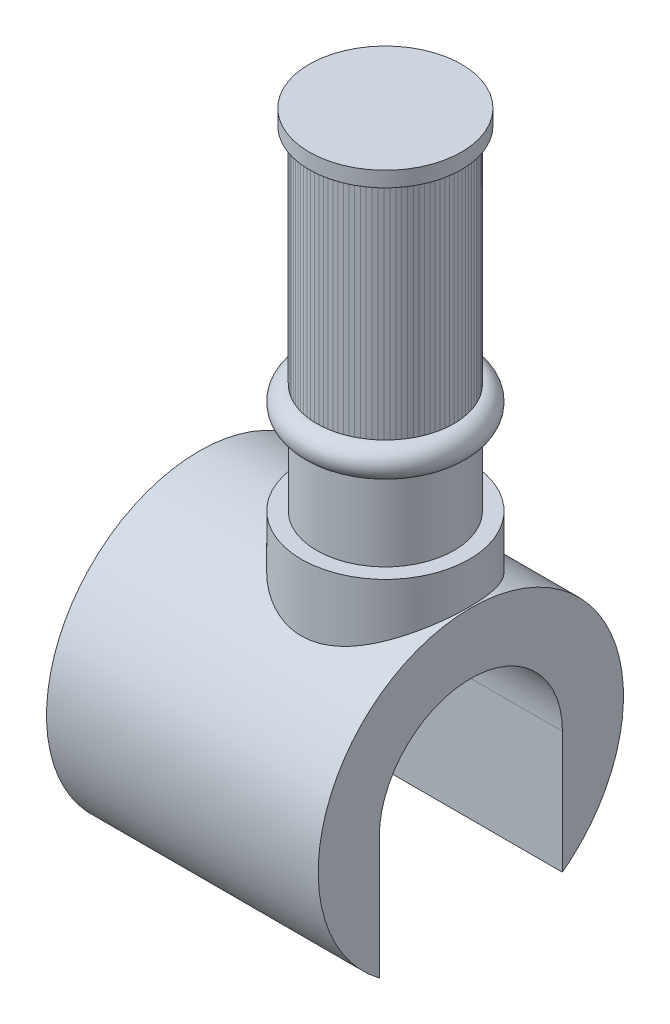
ISO-10303-21;
HEADER;
FILE_DESCRIPTION(('STEP AP214'),'2;1');
FILE_NAME('part.step','',(''),(''),'','','');
FILE_SCHEMA(('AUTOMOTIVE_DESIGN { 1 0 10303 214 1 1 1 1 }'));
ENDSEC;
DATA;
#1=APPLICATION_CONTEXT('core data for automotive mechanical design processes');
#2=APPLICATION_PROTOCOL_DEFINITION('international standard','automotive_design',2000,#1);
#3=PRODUCT_CONTEXT('',#1,'mechanical');
#4=PRODUCT('Part','Part','',(#3));
#5=PRODUCT_RELATED_PRODUCT_CATEGORY('part','',(#4));
#6=PRODUCT_DEFINITION_FORMATION('','',#4);
#7=PRODUCT_DEFINITION_CONTEXT('part definition',#1,'design');
#8=PRODUCT_DEFINITION('design','',#6,#7);
#9=PRODUCT_DEFINITION_SHAPE('','',#8);
#10=(LENGTH_UNIT() NAMED_UNIT(*) SI_UNIT(.MILLI.,.METRE.));
#11=(NAMED_UNIT(*) PLANE_ANGLE_UNIT() SI_UNIT($,.RADIAN.));
#12=(NAMED_UNIT(*) SI_UNIT($,.STERADIAN.) SOLID_ANGLE_UNIT());
#13=UNCERTAINTY_MEASURE_WITH_UNIT(LENGTH_MEASURE(1.E-05),#10,'distance_accuracy_value','');
#14=(GEOMETRIC_REPRESENTATION_CONTEXT(3) GLOBAL_UNCERTAINTY_ASSIGNED_CONTEXT((#13)) GLOBAL_UNIT_ASSIGNED_CONTEXT((#10,
#11,#12)) REPRESENTATION_CONTEXT('',''));
#15=CARTESIAN_POINT('',(0.,0.,0.));
#16=DIRECTION('',(0.,0.,1.));
#17=DIRECTION('',(1.,0.,0.));
#18=AXIS2_PLACEMENT_3D('',#15,#16,#17);
#19=CARTESIAN_POINT('',(0.,3.85,0.));
#20=DIRECTION('',(0.,-1.,0.));
#21=DIRECTION('',(0.,0.,-1.));
#22=AXIS2_PLACEMENT_3D('',#19,#20,#21);
#23=CYLINDRICAL_SURFACE('',#22,1.125);
#24=CARTESIAN_POINT('',(0.,3.85,0.));
#25=DIRECTION('',(0.,1.,0.));
#26=DIRECTION('',(0.,0.,1.));
#27=AXIS2_PLACEMENT_3D('',#24,#25,#26);
#28=CIRCLE('',#27,1.125);
#29=CARTESIAN_POINT('',(0.,3.85,-1.125));
#30=VERTEX_POINT('',#29);
#31=EDGE_CURVE('E11',#30,#30,#28,.T.);
#32=CARTESIAN_POINT('',(0.,0.,0.));
#33=DIRECTION('',(0.,1.,0.));
#34=DIRECTION('',(0.,0.,1.));
#35=AXIS2_PLACEMENT_3D('',#32,#33,#34);
#36=CIRCLE('',#35,1.125);
#37=CARTESIAN_POINT('',(0.,0.,-1.125));
#38=VERTEX_POINT('',#37);
#39=EDGE_CURVE('E50',#38,#38,#36,.T.);
#40=CARTESIAN_POINT('',(0.,3.85,-1.125));
#41=CARTESIAN_POINT('',(0.,3.80989583333333,-1.125));
#42=CARTESIAN_POINT('',(0.,3.76979166666667,-1.125));
#43=CARTESIAN_POINT('',(0.,3.68958333333333,-1.125));
#44=CARTESIAN_POINT('',(0.,3.64947916666667,-1.125));
#45=CARTESIAN_POINT('',(0.,3.56927083333333,-1.125));
#46=CARTESIAN_POINT('',(0.,3.52916666666667,-1.125));
#47=CARTESIAN_POINT('',(0.,3.44895833333333,-1.125));
#48=CARTESIAN_POINT('',(0.,3.40885416666667,-1.125));
#49=CARTESIAN_POINT('',(0.,3.32864583333333,-1.125));
#50=CARTESIAN_POINT('',(0.,3.28854166666667,-1.125));
#51=CARTESIAN_POINT('',(0.,3.20833333333333,-1.125));
#52=CARTESIAN_POINT('',(0.,3.16822916666667,-1.125));
#53=CARTESIAN_POINT('',(0.,3.08802083333333,-1.125));
#54=CARTESIAN_POINT('',(0.,3.04791666666667,-1.125));
#55=CARTESIAN_POINT('',(0.,2.96770833333333,-1.125));
#56=CARTESIAN_POINT('',(0.,2.92760416666667,-1.125));
#57=CARTESIAN_POINT('',(0.,2.84739583333333,-1.125));
#58=CARTESIAN_POINT('',(0.,2.80729166666667,-1.125));
#59=CARTESIAN_POINT('',(0.,2.72708333333333,-1.125));
#60=CARTESIAN_POINT('',(0.,2.68697916666667,-1.125));
#61=CARTESIAN_POINT('',(0.,2.60677083333333,-1.125));
#62=CARTESIAN_POINT('',(0.,2.56666666666667,-1.125));
#63=CARTESIAN_POINT('',(0.,2.48645833333333,-1.125));
#64=CARTESIAN_POINT('',(0.,2.44635416666667,-1.125));
#65=CARTESIAN_POINT('',(0.,2.36614583333333,-1.125));
#66=CARTESIAN_POINT('',(0.,2.32604166666667,-1.125));
#67=CARTESIAN_POINT('',(0.,2.24583333333333,-1.125));
#68=CARTESIAN_POINT('',(0.,2.20572916666667,-1.125));
#69=CARTESIAN_POINT('',(0.,2.12552083333333,-1.125));
#70=CARTESIAN_POINT('',(0.,2.08541666666667,-1.125));
#71=CARTESIAN_POINT('',(0.,2.00520833333333,-1.125));
#72=CARTESIAN_POINT('',(0.,1.96510416666667,-1.125));
#73=CARTESIAN_POINT('',(0.,1.88489583333333,-1.125));
#74=CARTESIAN_POINT('',(0.,1.84479166666667,-1.125));
#75=CARTESIAN_POINT('',(0.,1.76458333333333,-1.125));
#76=CARTESIAN_POINT('',(0.,1.72447916666667,-1.125));
#77=CARTESIAN_POINT('',(0.,1.64427083333333,-1.125));
#78=CARTESIAN_POINT('',(0.,1.60416666666667,-1.125));
#79=CARTESIAN_POINT('',(0.,1.52395833333333,-1.125));
#80=CARTESIAN_POINT('',(0.,1.48385416666667,-1.125));
#81=CARTESIAN_POINT('',(0.,1.40364583333333,-1.125));
#82=CARTESIAN_POINT('',(0.,1.36354166666667,-1.125));
#83=CARTESIAN_POINT('',(0.,1.28333333333333,-1.125));
#84=CARTESIAN_POINT('',(0.,1.24322916666667,-1.125));
#85=CARTESIAN_POINT('',(0.,1.16302083333333,-1.125));
#86=CARTESIAN_POINT('',(0.,1.12291666666667,-1.125));
#87=CARTESIAN_POINT('',(0.,1.04270833333333,-1.125));
#88=CARTESIAN_POINT('',(0.,1.00260416666667,-1.125));
#89=CARTESIAN_POINT('',(0.,0.922395833333333,-1.125));
#90=CARTESIAN_POINT('',(0.,0.882291666666666,-1.125));
#91=CARTESIAN_POINT('',(0.,0.802083333333333,-1.125));
#92=CARTESIAN_POINT('',(0.,0.761979166666666,-1.125));
#93=CARTESIAN_POINT('',(0.,0.681770833333333,-1.125));
#94=CARTESIAN_POINT('',(0.,0.641666666666666,-1.125));
#95=CARTESIAN_POINT('',(0.,0.561458333333333,-1.125));
#96=CARTESIAN_POINT('',(0.,0.521354166666666,-1.125));
#97=CARTESIAN_POINT('',(0.,0.441145833333333,-1.125));
#98=CARTESIAN_POINT('',(0.,0.401041666666666,-1.125));
#99=CARTESIAN_POINT('',(0.,0.320833333333333,-1.125));
#100=CARTESIAN_POINT('',(0.,0.280729166666666,-1.125));
#101=CARTESIAN_POINT('',(0.,0.200520833333333,-1.125));
#102=CARTESIAN_POINT('',(0.,0.160416666666666,-1.125));
#103=CARTESIAN_POINT('',(0.,0.080208333333333,-1.125));
#104=CARTESIAN_POINT('',(0.,0.0401041666666663,-1.125));
#105=CARTESIAN_POINT('',(0.,0.,-1.125));
#106=B_SPLINE_CURVE_WITH_KNOTS('',3,(#40,#41,#42,#43,#44,#45,#46,#47,#48,#49,#50,#51,#52,#53,
#54,#55,#56,#57,#58,#59,#60,#61,#62,#63,#64,#65,#66,#67,#68,#69,#70,#71,#72,#73,#74,#75,#76,#77,
#78,#79,#80,#81,#82,#83,#84,#85,#86,#87,#88,#89,#90,#91,#92,#93,#94,#95,#96,#97,#98,#99,#100,
#101,#102,#103,#104,#105),.UNSPECIFIED.,.F.,.F.,(4,2,2,2,2,2,2,2,2,2,2,2,2,2,2,2,2,2,2,2,2,2,2,
2,2,2,2,2,2,2,2,2,4),(0.,0.1203125,0.240625,0.3609375,0.48125,0.6015625,0.721875,0.8421875,
0.9625,1.0828125,1.203125,1.3234375,1.44375,1.5640625,1.684375,1.8046875,1.925,2.0453125,
2.165625,2.2859375,2.40625,2.5265625,2.646875,2.7671875,2.8875,3.0078125,3.128125,3.2484375,
3.36875,3.4890625,3.609375,3.7296875,3.85),.UNSPECIFIED.);
#107=EDGE_CURVE('BSEAM47',#30,#38,#106,.T.);
#108=ORIENTED_EDGE('',*,*,#31,.F.);
#109=ORIENTED_EDGE('',*,*,#39,.T.);
#110=ORIENTED_EDGE('',*,*,#107,.T.);
#111=ORIENTED_EDGE('',*,*,#107,.F.);
#112=EDGE_LOOP('',(#108,#110,#109,#111));
#113=FACE_BOUND('',#112,.T.);
#114=ADVANCED_FACE('F47',(#113),#23,.T.);
#115=CARTESIAN_POINT('',(0.,0.,0.));
#116=DIRECTION('',(0.,1.,0.));
#117=DIRECTION('',(0.,0.,1.));
#118=AXIS2_PLACEMENT_3D('',#115,#116,#117);
#119=PLANE('',#118);
#120=ORIENTED_EDGE('',*,*,#39,.F.);
#121=EDGE_LOOP('',(#120));
#122=FACE_BOUND('',#121,.T.);
#123=ADVANCED_FACE('F70',(#122),#119,.F.);
#124=CARTESIAN_POINT('',(0.,4.1,0.));
#125=DIRECTION('',(0.,-1.,0.));
#126=DIRECTION('',(0.,0.,-1.));
#127=AXIS2_PLACEMENT_3D('',#124,#125,#126);
#128=CYLINDRICAL_SURFACE('',#127,1.2468336916469);
#129=CARTESIAN_POINT('',(0.,4.1,0.));
#130=DIRECTION('',(0.,1.,0.));
#131=DIRECTION('',(0.,0.,1.));
#132=AXIS2_PLACEMENT_3D('',#129,#130,#131);
#133=CIRCLE('',#132,1.2468336916469);
#134=CARTESIAN_POINT('',(0.,4.1,1.2468336916469));
#135=VERTEX_POINT('',#134);
#136=EDGE_CURVE('E57',#135,#135,#133,.T.);
#137=ORIENTED_EDGE('',*,*,#136,.F.);
#138=EDGE_LOOP('',(#137));
#139=FACE_BOUND('',#138,.T.);
#140=CARTESIAN_POINT('',(0.,3.85,0.));
#141=DIRECTION('',(0.,1.,0.));
#142=DIRECTION('',(0.,0.,1.));
#143=AXIS2_PLACEMENT_3D('',#140,#141,#142);
#144=CIRCLE('',#143,1.2468336916469);
#145=CARTESIAN_POINT('',(0.,3.85,1.2468336916469));
#146=VERTEX_POINT('',#145);
#147=EDGE_CURVE('E59',#146,#146,#144,.T.);
#148=ORIENTED_EDGE('',*,*,#147,.T.);
#149=EDGE_LOOP('',(#148));
#150=FACE_BOUND('',#149,.T.);
#151=ADVANCED_FACE('F67',(#139,#150),#128,.T.);
#152=CARTESIAN_POINT('',(0.,4.1,0.));
#153=DIRECTION('',(0.,1.,0.));
#154=DIRECTION('',(0.,0.,1.));
#155=AXIS2_PLACEMENT_3D('',#152,#153,#154);
#156=PLANE('',#155);
#157=ORIENTED_EDGE('',*,*,#136,.T.);
#158=EDGE_LOOP('',(#157));
#159=FACE_BOUND('',#158,.T.);
#160=ADVANCED_FACE('F65',(#159),#156,.T.);
#161=CARTESIAN_POINT('',(0.,3.85,0.));
#162=DIRECTION('',(0.,1.,0.));
#163=DIRECTION('',(0.,0.,1.));
#164=AXIS2_PLACEMENT_3D('',#161,#162,#163);
#165=PLANE('',#164);
#166=ORIENTED_EDGE('',*,*,#31,.T.);
#167=EDGE_LOOP('',(#166));
#168=FACE_BOUND('',#167,.T.);
#169=ORIENTED_EDGE('',*,*,#147,.F.);
#170=EDGE_LOOP('',(#169));
#171=FACE_BOUND('',#170,.T.);
#172=ADVANCED_FACE('F74',(#168,#171),#165,.F.);
#173=CLOSED_SHELL('',(#114,#123,#151,#160,#172));
#174=MANIFOLD_SOLID_BREP('B2',#173);
#175=CARTESIAN_POINT('',(0.,3.78727061107852,0.));
#176=DIRECTION('',(0.,-1.,0.));
#177=DIRECTION('',(0.,0.,-1.));
#178=AXIS2_PLACEMENT_3D('',#175,#176,#177);
#179=PLANE('',#178);
#180=CARTESIAN_POINT('',(0.,3.78727061107852,0.));
#181=DIRECTION('',(0.,1.,0.));
#182=DIRECTION('',(0.,0.,1.));
#183=AXIS2_PLACEMENT_3D('',#180,#181,#182);
#184=CIRCLE('',#183,1.125);
#185=CARTESIAN_POINT('',(0.,3.78727061107852,1.125));
#186=VERTEX_POINT('',#185);
#187=EDGE_CURVE('E125',#186,#186,#184,.T.);
#188=ORIENTED_EDGE('',*,*,#187,.T.);
#189=EDGE_LOOP('',(#188));
#190=FACE_BOUND('',#189,.T.);
#191=ADVANCED_FACE('F118',(#190),#179,.F.);
#192=CARTESIAN_POINT('',(0.,4.06086458931636,0.));
#193=DIRECTION('',(0.,1.,0.));
#194=DIRECTION('',(0.,0.,1.));
#195=AXIS2_PLACEMENT_3D('',#192,#193,#194);
#196=CYLINDRICAL_SURFACE('',#195,1.125);
#197=ORIENTED_EDGE('',*,*,#187,.F.);
#198=EDGE_LOOP('',(#197));
#199=FACE_BOUND('',#198,.T.);
#200=CARTESIAN_POINT('',(0.,0.187270611078523,0.));
#201=DIRECTION('',(0.,1.,0.));
#202=DIRECTION('',(0.,0.,1.));
#203=AXIS2_PLACEMENT_3D('',#200,#201,#202);
#204=CIRCLE('',#203,1.125);
#205=CARTESIAN_POINT('',(0.,0.187270611078523,1.125));
#206=VERTEX_POINT('',#205);
#207=EDGE_CURVE('E200',#206,#206,#204,.T.);
#208=ORIENTED_EDGE('',*,*,#207,.T.);
#209=EDGE_LOOP('',(#208));
#210=FACE_BOUND('',#209,.T.);
#211=ADVANCED_FACE('F233',(#199,#210),#196,.T.);
#212=CARTESIAN_POINT('',(0.,-0.0627293889214769,0.));
#213=DIRECTION('',(0.,1.,0.));
#214=DIRECTION('',(0.,0.,1.));
#215=AXIS2_PLACEMENT_3D('',#212,#213,#214);
#216=TOROIDAL_SURFACE('',#215,1.125,0.25);
#217=ORIENTED_EDGE('',*,*,#207,.F.);
#218=EDGE_LOOP('',(#217));
#219=FACE_BOUND('',#218,.T.);
#220=CARTESIAN_POINT('',(0.,-0.312729388921477,0.));
#221=DIRECTION('',(0.,1.,0.));
#222=DIRECTION('',(0.,0.,1.));
#223=AXIS2_PLACEMENT_3D('',#220,#221,#222);
#224=CIRCLE('',#223,1.125);
#225=CARTESIAN_POINT('',(0.,-0.312729388921477,1.125));
#226=VERTEX_POINT('',#225);
#227=EDGE_CURVE('E197',#226,#226,#224,.T.);
#228=ORIENTED_EDGE('',*,*,#227,.T.);
#229=EDGE_LOOP('',(#228));
#230=FACE_BOUND('',#229,.T.);
#231=ADVANCED_FACE('F238',(#219,#230),#216,.T.);
#232=CARTESIAN_POINT('',(0.,4.06086458931636,0.));
#233=DIRECTION('',(0.,1.,0.));
#234=DIRECTION('',(0.,0.,1.));
#235=AXIS2_PLACEMENT_3D('',#232,#233,#234);
#236=CYLINDRICAL_SURFACE('',#235,1.125);
#237=ORIENTED_EDGE('',*,*,#227,.F.);
#238=EDGE_LOOP('',(#237));
#239=FACE_BOUND('',#238,.T.);
#240=CARTESIAN_POINT('',(0.,-1.61272938892148,0.));
#241=DIRECTION('',(0.,1.,0.));
#242=DIRECTION('',(0.,0.,1.));
#243=AXIS2_PLACEMENT_3D('',#240,#241,#242);
#244=CIRCLE('',#243,1.125);
#245=CARTESIAN_POINT('',(0.,-1.61272938892148,1.125));
#246=VERTEX_POINT('',#245);
#247=EDGE_CURVE('E194',#246,#246,#244,.T.);
#248=ORIENTED_EDGE('',*,*,#247,.T.);
#249=EDGE_LOOP('',(#248));
#250=FACE_BOUND('',#249,.T.);
#251=ADVANCED_FACE('F246',(#239,#250),#236,.T.);
#252=CARTESIAN_POINT('',(1.125,-1.61272938892148,0.));
#253=DIRECTION('',(0.,-1.,0.));
#254=DIRECTION('',(0.,0.,-1.));
#255=AXIS2_PLACEMENT_3D('',#252,#253,#254);
#256=PLANE('',#255);
#257=ORIENTED_EDGE('',*,*,#247,.F.);
#258=EDGE_LOOP('',(#257));
#259=FACE_BOUND('',#258,.T.);
#260=CARTESIAN_POINT('',(0.,-1.61272938892148,0.));
#261=DIRECTION('',(0.,1.,0.));
#262=DIRECTION('',(0.,0.,1.));
#263=AXIS2_PLACEMENT_3D('',#260,#261,#262);
#264=CIRCLE('',#263,1.375);
#265=CARTESIAN_POINT('',(0.,-1.61272938892148,1.375));
#266=VERTEX_POINT('',#265);
#267=EDGE_CURVE('E191',#266,#266,#264,.T.);
#268=ORIENTED_EDGE('',*,*,#267,.T.);
#269=EDGE_LOOP('',(#268));
#270=FACE_BOUND('',#269,.T.);
#271=ADVANCED_FACE('F252',(#259,#270),#256,.F.);
#272=CARTESIAN_POINT('',(0.,4.06086458931636,0.));
#273=DIRECTION('',(0.,1.,0.));
#274=DIRECTION('',(0.,0.,1.));
#275=AXIS2_PLACEMENT_3D('',#272,#273,#274);
#276=CYLINDRICAL_SURFACE('',#275,1.375);
#277=CARTESIAN_POINT('',(0.,-2.70127921924157,1.375));
#278=CARTESIAN_POINT('',(0.0704685367471656,-2.70127176644918,1.37499465095829));
#279=CARTESIAN_POINT('',(0.140998683030286,-2.69765520291326,1.36954510079474));
#280=CARTESIAN_POINT('',(0.279798342219602,-2.68375497621943,1.34806964830224));
#281=CARTESIAN_POINT('',(0.348063839782558,-2.6734600734851,1.33202591525464));
#282=CARTESIAN_POINT('',(0.480048465283065,-2.64777823514197,1.29032611253404));
#283=CARTESIAN_POINT('',(0.543793053032712,-2.63242311986542,1.26472998162088));
#284=CARTESIAN_POINT('',(0.666058957769828,-2.59840273895297,1.20483640022772));
#285=CARTESIAN_POINT('',(0.724579182815765,-2.57973678374368,1.17053713643921));
#286=CARTESIAN_POINT('',(0.841244183738277,-2.53890562889374,1.09015822960083));
#287=CARTESIAN_POINT('',(0.898753214100255,-2.51657743619669,1.04323831307106));
#288=CARTESIAN_POINT('',(1.00559618729684,-2.47224583761587,0.940685415542243));
#289=CARTESIAN_POINT('',(1.05492523287137,-2.45024263342733,0.885047253519022));
#290=CARTESIAN_POINT('',(1.14817732293746,-2.40678872752013,0.760820032335285));
#291=CARTESIAN_POINT('',(1.19127257427136,-2.38554766470016,0.691529174438545));
#292=CARTESIAN_POINT('',(1.26489825515028,-2.34822104309626,0.545291296998246));
#293=CARTESIAN_POINT('',(1.2954382590798,-2.33213155789934,0.468350167216405));
#294=CARTESIAN_POINT('',(1.34041165399969,-2.30811266921626,0.315769045285977));
#295=CARTESIAN_POINT('',(1.35597345272663,-2.29961585013154,0.240553135156924));
#296=CARTESIAN_POINT('',(1.37431231529329,-2.28958152015676,0.0881407074766047));
#297=CARTESIAN_POINT('',(1.37709907166548,-2.28803873319869,0.0109457361894071));
#298=CARTESIAN_POINT('',(1.37013323021925,-2.29186480210527,-0.134547452286148));
#299=CARTESIAN_POINT('',(1.36166308246831,-2.29652685040064,-0.202930863368679));
#300=CARTESIAN_POINT('',(1.33478655055561,-2.31110636288085,-0.337124112261399));
#301=CARTESIAN_POINT('',(1.31637940335505,-2.32102423064663,-0.402933752021505));
#302=CARTESIAN_POINT('',(1.27015200379158,-2.34536758752546,-0.531066191488672));
#303=CARTESIAN_POINT('',(1.24223254062094,-2.35984045748992,-0.593343822554576));
#304=CARTESIAN_POINT('',(1.17797379488146,-2.39206233914102,-0.712451451087781));
#305=CARTESIAN_POINT('',(1.14163181901246,-2.40981239841746,-0.769279697748433));
#306=CARTESIAN_POINT('',(1.05709604163206,-2.44925906878251,-0.882430976598775));
#307=CARTESIAN_POINT('',(1.00804672427283,-2.47117485386504,-0.938038476629881));
#308=CARTESIAN_POINT('',(0.901729828791875,-2.51539387197133,-1.04066148319863));
#309=CARTESIAN_POINT('',(0.84445379895127,-2.53769748245794,-1.08766803921216));
#310=CARTESIAN_POINT('',(0.71725170480881,-2.58238868245801,-1.17587297622578));
#311=CARTESIAN_POINT('',(0.64665652085291,-2.60461174232343,-1.21619915070494));
#312=CARTESIAN_POINT('',(0.498260284370251,-2.64383527651273,-1.28413393700168));
#313=CARTESIAN_POINT('',(0.42046768842074,-2.66084178108089,-1.31175725168564));
#314=CARTESIAN_POINT('',(0.266347971738293,-2.68561694792473,-1.35110400623));
#315=CARTESIAN_POINT('',(0.190410244015702,-2.69402095383821,-1.3639317345756));
#316=CARTESIAN_POINT('',(0.0370321394962129,-2.70234808627007,-1.37664667123583));
#317=CARTESIAN_POINT('',(-0.0404064175043313,-2.70228091089821,-1.37654867737126));
#318=CARTESIAN_POINT('',(-0.182483913979604,-2.69434675833799,-1.36442555831316));
#319=CARTESIAN_POINT('',(-0.247347302323486,-2.68761486962972,-1.35413606315909));
#320=CARTESIAN_POINT('',(-0.374245702257003,-2.66893336933427,-1.3246924378774));
#321=CARTESIAN_POINT('',(-0.436279459331019,-2.65698146781802,-1.30553441706024));
#322=CARTESIAN_POINT('',(-0.558807011950578,-2.62865167986148,-1.25811739611797));
#323=CARTESIAN_POINT('',(-0.619125683912531,-2.61210847033738,-1.22950882226437));
#324=CARTESIAN_POINT('',(-0.734467944152485,-2.57654480840132,-1.16429240061993));
#325=CARTESIAN_POINT('',(-0.789488893318822,-2.55752313230687,-1.1276805953372));
#326=CARTESIAN_POINT('',(-0.901813319027543,-2.51553463880067,-1.04075320607113));
#327=CARTESIAN_POINT('',(-0.958097212878038,-2.49242026188164,-0.989185466957061));
#328=CARTESIAN_POINT('',(-1.06162052881871,-2.44734530132543,-0.877158618733897));
#329=CARTESIAN_POINT('',(-1.10885464717162,-2.4253853997199,-0.816694332161146));
#330=CARTESIAN_POINT('',(-1.19515297064862,-2.3837251371833,-0.684659526681351));
#331=CARTESIAN_POINT('',(-1.23368317315145,-2.36419521959545,-0.612681970412822));
#332=CARTESIAN_POINT('',(-1.29767858781323,-2.33102231448092,-0.46189128015022));
#333=CARTESIAN_POINT('',(-1.32315738380128,-2.31737320860039,-0.383085353404495));
#334=CARTESIAN_POINT('',(-1.35775509865986,-2.29867147973637,-0.229514831662881));
#335=CARTESIAN_POINT('',(-1.36827580778696,-2.29288497669926,-0.155155941187782));
#336=CARTESIAN_POINT('',(-1.37702657786213,-2.28807888148077,-0.00551396924072118));
#337=CARTESIAN_POINT('',(-1.37526311318302,-2.28905572467666,0.0697686045209109));
#338=CARTESIAN_POINT('',(-1.36027505961511,-2.29726550174011,0.211965305247527));
#339=CARTESIAN_POINT('',(-1.34808861100472,-2.30393164970421,0.279026135873195));
#340=CARTESIAN_POINT('',(-1.31419598167461,-2.32215168009138,0.409988194897398));
#341=CARTESIAN_POINT('',(-1.29248866503723,-2.33370614572504,0.473889045271788));
#342=CARTESIAN_POINT('',(-1.2394894733003,-2.36119189542394,0.599233566234247));
#343=CARTESIAN_POINT('',(-1.20789533829576,-2.37725928912765,0.660518580171178));
#344=CARTESIAN_POINT('',(-1.136395415427,-2.41226043351368,0.777118671057871));
#345=CARTESIAN_POINT('',(-1.09648626616728,-2.43119534255851,0.832431319870569));
#346=CARTESIAN_POINT('',(-1.00422833195778,-2.47273654592457,0.942268421909821));
#347=CARTESIAN_POINT('',(-0.950976805227666,-2.49551463911708,0.995970796715524));
#348=CARTESIAN_POINT('',(-0.836244052041016,-2.54065853417303,1.0940870058567));
#349=CARTESIAN_POINT('',(-0.774752945609084,-2.56302380381431,1.13848952242758));
#350=CARTESIAN_POINT('',(-0.640229999953361,-2.60631495451251,1.21954968620274));
#351=CARTESIAN_POINT('',(-0.566703001158265,-2.62704669603335,1.255497439569));
#352=CARTESIAN_POINT('',(-0.413184333007244,-2.66208347562263,1.31400077724253));
#353=CARTESIAN_POINT('',(-0.333214206030595,-2.67640895986841,1.33659904291014));
#354=CARTESIAN_POINT('',(-0.210159347433569,-2.69113314316924,1.35949572163625));
#355=CARTESIAN_POINT('',(-0.168437696474325,-2.69491533250273,1.36529536709138));
#356=CARTESIAN_POINT('',(-0.0844847395983001,-2.69999057732014,1.37304906730563));
#357=CARTESIAN_POINT('',(-0.0422534450018093,-2.70128368798987,1.37500320732415));
#358=CARTESIAN_POINT('',(0.,-2.70127921924157,1.375));
#359=B_SPLINE_CURVE_WITH_KNOTS('',3,(#277,#278,#279,#280,#281,#282,#283,#284,#285,#286,#287,
#288,#289,#290,#291,#292,#293,#294,#295,#296,#297,#298,#299,#300,#301,#302,#303,#304,#305,#306,
#307,#308,#309,#310,#311,#312,#313,#314,#315,#316,#317,#318,#319,#320,#321,#322,#323,#324,#325,
#326,#327,#328,#329,#330,#331,#332,#333,#334,#335,#336,#337,#338,#339,#340,#341,#342,#343,#344,
#345,#346,#347,#348,#349,#350,#351,#352,#353,#354,#355,#356,#357,#358),.UNSPECIFIED.,.T.,.F.,(4,
2,2,2,2,2,2,2,2,2,2,2,2,2,2,2,2,2,2,2,2,2,2,2,2,2,2,2,2,2,2,2,2,2,2,2,2,2,2,2,4),(0.,
0.211226220815763,0.422808858726636,0.633085603098681,0.843406194916589,1.07498399731937,
1.3066999459365,1.55831074470766,1.80972931252314,2.0402357210683,2.27056721347915,
2.47678052578317,2.68300967497523,2.89145915192115,3.09997537777671,3.33098073314887,
3.5622251324413,3.81377086163806,4.06502470300884,4.29597896356219,4.52666882186316,
4.72382885046841,4.9210754567675,5.12663611348424,5.3322986480877,5.5705466612761,
5.80893387850863,6.05937738905195,6.30955970708779,6.53426456002778,6.75885099125693,
6.96337042753296,7.16791427129583,7.37944992247839,7.5910712547473,7.82702788338708,
8.06327001967241,8.31519630608279,8.56631270497675,8.69296828491894,8.81962105672547),.UNSPECIFIED.);
#360=CARTESIAN_POINT('',(0.,-2.70127921924157,1.375));
#361=VERTEX_POINT('',#360);
#362=EDGE_CURVE('E190',#361,#361,#359,.T.);
#363=ORIENTED_EDGE('',*,*,#362,.T.);
#364=EDGE_LOOP('',(#363));
#365=FACE_BOUND('',#364,.T.);
#366=ORIENTED_EDGE('',*,*,#267,.F.);
#367=EDGE_LOOP('',(#366));
#368=FACE_BOUND('',#367,.T.);
#369=ADVANCED_FACE('F210',(#365,#368),#276,.T.);
#370=CARTESIAN_POINT('',(-3.05,-4.78919085530283,0.));
#371=DIRECTION('',(1.,0.,0.));
#372=DIRECTION('',(0.,0.,-1.));
#373=AXIS2_PLACEMENT_3D('',#370,#371,#372);
#374=CYLINDRICAL_SURFACE('',#373,2.5);
#375=DIRECTION('',(1.,0.,0.));
#376=VECTOR('',#375,1.);
#377=CARTESIAN_POINT('',(-3.05,-6.78919085530283,1.5));
#378=LINE('',#377,#376);
#379=CARTESIAN_POINT('',(1.4,-6.78919085530283,1.5));
#380=VERTEX_POINT('',#379);
#381=CARTESIAN_POINT('',(-3.05,-6.78919085530283,1.5));
#382=VERTEX_POINT('',#381);
#383=EDGE_CURVE('E183',#380,#382,#378,.F.);
#384=ORIENTED_EDGE('',*,*,#383,.F.);
#385=CARTESIAN_POINT('',(1.4,-4.78919085530283,0.));
#386=DIRECTION('',(1.,0.,0.));
#387=DIRECTION('',(0.,0.,-1.));
#388=AXIS2_PLACEMENT_3D('',#385,#386,#387);
#389=CIRCLE('',#388,2.5);
#390=CARTESIAN_POINT('',(1.4,-6.78919085530283,-1.5));
#391=VERTEX_POINT('',#390);
#392=EDGE_CURVE('E185',#391,#380,#389,.T.);
#393=ORIENTED_EDGE('',*,*,#392,.F.);
#394=DIRECTION('',(1.,0.,0.));
#395=VECTOR('',#394,1.);
#396=CARTESIAN_POINT('',(-3.05,-6.78919085530283,-1.5));
#397=LINE('',#396,#395);
#398=CARTESIAN_POINT('',(-3.05,-6.78919085530283,-1.5));
#399=VERTEX_POINT('',#398);
#400=EDGE_CURVE('E132',#399,#391,#397,.T.);
#401=ORIENTED_EDGE('',*,*,#400,.F.);
#402=CARTESIAN_POINT('',(-3.05,-4.78919085530283,0.));
#403=DIRECTION('',(1.,0.,0.));
#404=DIRECTION('',(0.,0.,-1.));
#405=AXIS2_PLACEMENT_3D('',#402,#403,#404);
#406=CIRCLE('',#405,2.5);
#407=EDGE_CURVE('E187',#399,#382,#406,.T.);
#408=ORIENTED_EDGE('',*,*,#407,.T.);
#409=EDGE_LOOP('',(#384,#393,#401,#408));
#410=FACE_BOUND('',#409,.T.);
#411=ORIENTED_EDGE('',*,*,#362,.F.);
#412=EDGE_LOOP('',(#411));
#413=FACE_BOUND('',#412,.T.);
#414=ADVANCED_FACE('F213',(#410,#413),#374,.T.);
#415=CARTESIAN_POINT('',(-3.05,-4.78919085530283,0.));
#416=DIRECTION('',(1.,0.,0.));
#417=DIRECTION('',(0.,0.,-1.));
#418=AXIS2_PLACEMENT_3D('',#415,#416,#417);
#419=PLANE('',#418);
#420=CARTESIAN_POINT('',(-3.05,-4.78919085530283,0.));
#421=DIRECTION('',(-1.,0.,0.));
#422=DIRECTION('',(0.,0.,1.));
#423=AXIS2_PLACEMENT_3D('',#420,#421,#422);
#424=CIRCLE('',#423,1.5);
#425=CARTESIAN_POINT('',(-3.05,-4.78919085530283,1.5));
#426=VERTEX_POINT('',#425);
#427=CARTESIAN_POINT('',(-3.05,-4.78919085530283,-1.5));
#428=VERTEX_POINT('',#427);
#429=EDGE_CURVE('E163',#426,#428,#424,.T.);
#430=ORIENTED_EDGE('',*,*,#429,.F.);
#431=DIRECTION('',(0.,1.,0.));
#432=VECTOR('',#431,1.);
#433=CARTESIAN_POINT('',(-3.05,-4.78919085530283,1.5));
#434=LINE('',#433,#432);
#435=EDGE_CURVE('E174',#382,#426,#434,.T.);
#436=ORIENTED_EDGE('',*,*,#435,.F.);
#437=ORIENTED_EDGE('',*,*,#407,.F.);
#438=DIRECTION('',(0.,-1.,0.));
#439=VECTOR('',#438,1.);
#440=CARTESIAN_POINT('',(-3.05,-4.78919085530283,-1.5));
#441=LINE('',#440,#439);
#442=EDGE_CURVE('E176',#428,#399,#441,.T.);
#443=ORIENTED_EDGE('',*,*,#442,.F.);
#444=EDGE_LOOP('',(#430,#436,#437,#443));
#445=FACE_BOUND('',#444,.T.);
#446=ADVANCED_FACE('F217',(#445),#419,.F.);
#447=CARTESIAN_POINT('',(1.4,-4.78919085530283,0.));
#448=DIRECTION('',(1.,0.,0.));
#449=DIRECTION('',(0.,0.,-1.));
#450=AXIS2_PLACEMENT_3D('',#447,#448,#449);
#451=PLANE('',#450);
#452=DIRECTION('',(0.,-1.,0.));
#453=VECTOR('',#452,1.);
#454=CARTESIAN_POINT('',(1.4,-4.78919085530283,1.5));
#455=LINE('',#454,#453);
#456=CARTESIAN_POINT('',(1.4,-4.78919085530283,1.5));
#457=VERTEX_POINT('',#456);
#458=EDGE_CURVE('E45',#457,#380,#455,.T.);
#459=ORIENTED_EDGE('',*,*,#458,.F.);
#460=CARTESIAN_POINT('',(1.4,-4.78919085530283,0.));
#461=DIRECTION('',(-1.,0.,0.));
#462=DIRECTION('',(0.,0.,1.));
#463=AXIS2_PLACEMENT_3D('',#460,#461,#462);
#464=CIRCLE('',#463,1.5);
#465=CARTESIAN_POINT('',(1.4,-4.78919085530283,-1.5));
#466=VERTEX_POINT('',#465);
#467=EDGE_CURVE('E161',#457,#466,#464,.T.);
#468=ORIENTED_EDGE('',*,*,#467,.T.);
#469=DIRECTION('',(0.,-1.,0.));
#470=VECTOR('',#469,1.);
#471=CARTESIAN_POINT('',(1.4,-4.78919085530283,-1.5));
#472=LINE('',#471,#470);
#473=EDGE_CURVE('E166',#466,#391,#472,.T.);
#474=ORIENTED_EDGE('',*,*,#473,.T.);
#475=ORIENTED_EDGE('',*,*,#392,.T.);
#476=EDGE_LOOP('',(#459,#468,#474,#475));
#477=FACE_BOUND('',#476,.T.);
#478=ADVANCED_FACE('F173',(#477),#451,.T.);
#479=CARTESIAN_POINT('',(1.4,-4.78919085530283,0.));
#480=DIRECTION('',(-1.,0.,0.));
#481=DIRECTION('',(0.,0.,1.));
#482=AXIS2_PLACEMENT_3D('',#479,#480,#481);
#483=CYLINDRICAL_SURFACE('',#482,1.5);
#484=ORIENTED_EDGE('',*,*,#429,.T.);
#485=DIRECTION('',(-1.,0.,0.));
#486=VECTOR('',#485,1.);
#487=CARTESIAN_POINT('',(1.4,-4.78919085530283,-1.5));
#488=LINE('',#487,#486);
#489=EDGE_CURVE('E157',#466,#428,#488,.T.);
#490=ORIENTED_EDGE('',*,*,#489,.F.);
#491=ORIENTED_EDGE('',*,*,#467,.F.);
#492=DIRECTION('',(-1.,0.,0.));
#493=VECTOR('',#492,1.);
#494=CARTESIAN_POINT('',(1.4,-4.78919085530283,1.5));
#495=LINE('',#494,#493);
#496=EDGE_CURVE('E165',#457,#426,#495,.T.);
#497=ORIENTED_EDGE('',*,*,#496,.T.);
#498=EDGE_LOOP('',(#484,#490,#491,#497));
#499=FACE_BOUND('',#498,.T.);
#500=ADVANCED_FACE('F158',(#499),#483,.F.);
#501=CARTESIAN_POINT('',(1.4,-4.78919085530283,1.5));
#502=DIRECTION('',(0.,0.,1.));
#503=DIRECTION('',(0.,-1.,0.));
#504=AXIS2_PLACEMENT_3D('',#501,#502,#503);
#505=PLANE('',#504);
#506=ORIENTED_EDGE('',*,*,#383,.T.);
#507=ORIENTED_EDGE('',*,*,#435,.T.);
#508=ORIENTED_EDGE('',*,*,#496,.F.);
#509=ORIENTED_EDGE('',*,*,#458,.T.);
#510=EDGE_LOOP('',(#506,#507,#508,#509));
#511=FACE_BOUND('',#510,.T.);
#512=ADVANCED_FACE('F226',(#511),#505,.F.);
#513=CARTESIAN_POINT('',(1.4,-4.78919085530283,-1.5));
#514=DIRECTION('',(0.,0.,-1.));
#515=DIRECTION('',(-1.,0.,0.));
#516=AXIS2_PLACEMENT_3D('',#513,#514,#515);
#517=PLANE('',#516);
#518=ORIENTED_EDGE('',*,*,#400,.T.);
#519=ORIENTED_EDGE('',*,*,#473,.F.);
#520=ORIENTED_EDGE('',*,*,#489,.T.);
#521=ORIENTED_EDGE('',*,*,#442,.T.);
#522=EDGE_LOOP('',(#518,#519,#520,#521));
#523=FACE_BOUND('',#522,.T.);
#524=ADVANCED_FACE('F168',(#523),#517,.F.);
#525=CLOSED_SHELL('',(#191,#211,#231,#251,#271,#369,#414,#446,#478,#500,#512,#524));
#526=MANIFOLD_SOLID_BREP('B6',#525);
#527=ADVANCED_BREP_SHAPE_REPRESENTATION('',(#18,#174,#526),#14);
#528=SHAPE_DEFINITION_REPRESENTATION(#9,#527);
ENDSEC;
END-ISO-10303-21;
